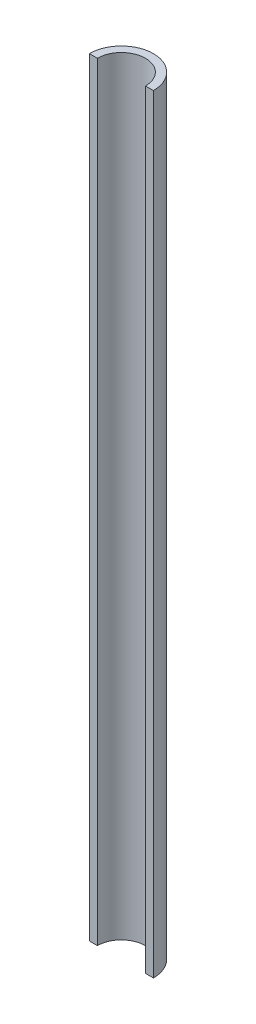
ISO-10303-21;
HEADER;
FILE_DESCRIPTION(('STEP AP214'),'2;1');
FILE_NAME('part.step','',(''),(''),'','','');
FILE_SCHEMA(('AUTOMOTIVE_DESIGN { 1 0 10303 214 1 1 1 1 }'));
ENDSEC;
DATA;
#1=APPLICATION_CONTEXT('core data for automotive mechanical design processes');
#2=APPLICATION_PROTOCOL_DEFINITION('international standard','automotive_design',2000,#1);
#3=PRODUCT_CONTEXT('',#1,'mechanical');
#4=PRODUCT('Part','Part','',(#3));
#5=PRODUCT_RELATED_PRODUCT_CATEGORY('part','',(#4));
#6=PRODUCT_DEFINITION_FORMATION('','',#4);
#7=PRODUCT_DEFINITION_CONTEXT('part definition',#1,'design');
#8=PRODUCT_DEFINITION('design','',#6,#7);
#9=PRODUCT_DEFINITION_SHAPE('','',#8);
#10=(LENGTH_UNIT() NAMED_UNIT(*) SI_UNIT(.MILLI.,.METRE.));
#11=(NAMED_UNIT(*) PLANE_ANGLE_UNIT() SI_UNIT($,.RADIAN.));
#12=(NAMED_UNIT(*) SI_UNIT($,.STERADIAN.) SOLID_ANGLE_UNIT());
#13=UNCERTAINTY_MEASURE_WITH_UNIT(LENGTH_MEASURE(1.E-05),#10,'distance_accuracy_value','');
#14=(GEOMETRIC_REPRESENTATION_CONTEXT(3) GLOBAL_UNCERTAINTY_ASSIGNED_CONTEXT((#13)) GLOBAL_UNIT_ASSIGNED_CONTEXT((#10,
#11,#12)) REPRESENTATION_CONTEXT('',''));
#15=CARTESIAN_POINT('',(0.,0.,0.));
#16=DIRECTION('',(0.,0.,1.));
#17=DIRECTION('',(1.,0.,0.));
#18=AXIS2_PLACEMENT_3D('',#15,#16,#17);
#19=CARTESIAN_POINT('',(0.,76.2,0.));
#20=DIRECTION('',(0.,-1.,0.));
#21=DIRECTION('',(0.,0.,-1.));
#22=AXIS2_PLACEMENT_3D('',#19,#20,#21);
#23=CYLINDRICAL_SURFACE('',#22,2.38125);
#24=CARTESIAN_POINT('',(0.,0.,0.));
#25=DIRECTION('',(0.,-1.,0.));
#26=DIRECTION('',(0.,0.,-1.));
#27=AXIS2_PLACEMENT_3D('',#24,#25,#26);
#28=CIRCLE('',#27,2.38125);
#29=CARTESIAN_POINT('',(-2.38125,0.,0.));
#30=VERTEX_POINT('',#29);
#31=CARTESIAN_POINT('',(2.38125,0.,0.));
#32=VERTEX_POINT('',#31);
#33=EDGE_CURVE('E97',#30,#32,#28,.T.);
#34=ORIENTED_EDGE('',*,*,#33,.T.);
#35=DIRECTION('',(0.,-1.,0.));
#36=VECTOR('',#35,1.);
#37=CARTESIAN_POINT('',(2.38125,76.2,0.));
#38=LINE('',#37,#36);
#39=CARTESIAN_POINT('',(2.38125,76.2,0.));
#40=VERTEX_POINT('',#39);
#41=EDGE_CURVE('E11',#40,#32,#38,.T.);
#42=ORIENTED_EDGE('',*,*,#41,.F.);
#43=CARTESIAN_POINT('',(0.,76.2,0.));
#44=DIRECTION('',(0.,-1.,0.));
#45=DIRECTION('',(0.,0.,-1.));
#46=AXIS2_PLACEMENT_3D('',#43,#44,#45);
#47=CIRCLE('',#46,2.38125);
#48=CARTESIAN_POINT('',(-2.38125,76.2,0.));
#49=VERTEX_POINT('',#48);
#50=EDGE_CURVE('E85',#49,#40,#47,.T.);
#51=ORIENTED_EDGE('',*,*,#50,.F.);
#52=DIRECTION('',(0.,-1.,0.));
#53=VECTOR('',#52,1.);
#54=CARTESIAN_POINT('',(-2.38125,76.2,0.));
#55=LINE('',#54,#53);
#56=EDGE_CURVE('E93',#49,#30,#55,.T.);
#57=ORIENTED_EDGE('',*,*,#56,.T.);
#58=EDGE_LOOP('',(#34,#42,#51,#57));
#59=FACE_BOUND('',#58,.T.);
#60=ADVANCED_FACE('F34',(#59),#23,.F.);
#61=CARTESIAN_POINT('',(2.38125,76.2,0.));
#62=DIRECTION('',(0.,0.,-1.));
#63=DIRECTION('',(-1.,0.,0.));
#64=AXIS2_PLACEMENT_3D('',#61,#62,#63);
#65=PLANE('',#64);
#66=DIRECTION('',(1.,0.,0.));
#67=VECTOR('',#66,1.);
#68=CARTESIAN_POINT('',(2.38125,0.,0.));
#69=LINE('',#68,#67);
#70=CARTESIAN_POINT('',(3.175,0.,0.));
#71=VERTEX_POINT('',#70);
#72=EDGE_CURVE('E89',#32,#71,#69,.T.);
#73=ORIENTED_EDGE('',*,*,#72,.T.);
#74=DIRECTION('',(0.,-1.,0.));
#75=VECTOR('',#74,1.);
#76=CARTESIAN_POINT('',(3.175,76.2,0.));
#77=LINE('',#76,#75);
#78=CARTESIAN_POINT('',(3.175,76.2,0.));
#79=VERTEX_POINT('',#78);
#80=EDGE_CURVE('E42',#79,#71,#77,.T.);
#81=ORIENTED_EDGE('',*,*,#80,.F.);
#82=DIRECTION('',(1.,0.,0.));
#83=VECTOR('',#82,1.);
#84=CARTESIAN_POINT('',(2.38125,76.2,0.));
#85=LINE('',#84,#83);
#86=EDGE_CURVE('E80',#40,#79,#85,.T.);
#87=ORIENTED_EDGE('',*,*,#86,.F.);
#88=ORIENTED_EDGE('',*,*,#41,.T.);
#89=EDGE_LOOP('',(#73,#81,#87,#88));
#90=FACE_BOUND('',#89,.T.);
#91=ADVANCED_FACE('F88',(#90),#65,.F.);
#92=CARTESIAN_POINT('',(0.,76.2,0.));
#93=DIRECTION('',(0.,-1.,0.));
#94=DIRECTION('',(0.,0.,-1.));
#95=AXIS2_PLACEMENT_3D('',#92,#93,#94);
#96=CYLINDRICAL_SURFACE('',#95,3.175);
#97=CARTESIAN_POINT('',(0.,0.,0.));
#98=DIRECTION('',(0.,1.,0.));
#99=DIRECTION('',(0.,0.,-1.));
#100=AXIS2_PLACEMENT_3D('',#97,#98,#99);
#101=CIRCLE('',#100,3.175);
#102=CARTESIAN_POINT('',(-3.175,0.,0.));
#103=VERTEX_POINT('',#102);
#104=EDGE_CURVE('E67',#71,#103,#101,.T.);
#105=ORIENTED_EDGE('',*,*,#104,.T.);
#106=DIRECTION('',(0.,-1.,0.));
#107=VECTOR('',#106,1.);
#108=CARTESIAN_POINT('',(-3.175,76.2,0.));
#109=LINE('',#108,#107);
#110=CARTESIAN_POINT('',(-3.175,76.2,0.));
#111=VERTEX_POINT('',#110);
#112=EDGE_CURVE('E90',#111,#103,#109,.T.);
#113=ORIENTED_EDGE('',*,*,#112,.F.);
#114=CARTESIAN_POINT('',(0.,76.2,0.));
#115=DIRECTION('',(0.,1.,0.));
#116=DIRECTION('',(0.,0.,-1.));
#117=AXIS2_PLACEMENT_3D('',#114,#115,#116);
#118=CIRCLE('',#117,3.175);
#119=EDGE_CURVE('E83',#79,#111,#118,.T.);
#120=ORIENTED_EDGE('',*,*,#119,.F.);
#121=ORIENTED_EDGE('',*,*,#80,.T.);
#122=EDGE_LOOP('',(#105,#113,#120,#121));
#123=FACE_BOUND('',#122,.T.);
#124=ADVANCED_FACE('F91',(#123),#96,.T.);
#125=CARTESIAN_POINT('',(-3.175,76.2,0.));
#126=DIRECTION('',(0.,0.,-1.));
#127=DIRECTION('',(-1.,0.,0.));
#128=AXIS2_PLACEMENT_3D('',#125,#126,#127);
#129=PLANE('',#128);
#130=DIRECTION('',(1.,0.,0.));
#131=VECTOR('',#130,1.);
#132=CARTESIAN_POINT('',(-3.175,0.,0.));
#133=LINE('',#132,#131);
#134=EDGE_CURVE('E73',#103,#30,#133,.T.);
#135=ORIENTED_EDGE('',*,*,#134,.T.);
#136=ORIENTED_EDGE('',*,*,#56,.F.);
#137=DIRECTION('',(1.,0.,0.));
#138=VECTOR('',#137,1.);
#139=CARTESIAN_POINT('',(-3.175,76.2,0.));
#140=LINE('',#139,#138);
#141=EDGE_CURVE('E50',#111,#49,#140,.T.);
#142=ORIENTED_EDGE('',*,*,#141,.F.);
#143=ORIENTED_EDGE('',*,*,#112,.T.);
#144=EDGE_LOOP('',(#135,#136,#142,#143));
#145=FACE_BOUND('',#144,.T.);
#146=ADVANCED_FACE('F104',(#145),#129,.F.);
#147=CARTESIAN_POINT('',(0.,76.2,0.));
#148=DIRECTION('',(0.,-1.,0.));
#149=DIRECTION('',(0.,0.,-1.));
#150=AXIS2_PLACEMENT_3D('',#147,#148,#149);
#151=PLANE('',#150);
#152=ORIENTED_EDGE('',*,*,#50,.T.);
#153=ORIENTED_EDGE('',*,*,#86,.T.);
#154=ORIENTED_EDGE('',*,*,#119,.T.);
#155=ORIENTED_EDGE('',*,*,#141,.T.);
#156=EDGE_LOOP('',(#152,#153,#154,#155));
#157=FACE_BOUND('',#156,.T.);
#158=ADVANCED_FACE('F81',(#157),#151,.F.);
#159=CARTESIAN_POINT('',(0.,0.,0.));
#160=DIRECTION('',(0.,-1.,0.));
#161=DIRECTION('',(0.,0.,-1.));
#162=AXIS2_PLACEMENT_3D('',#159,#160,#161);
#163=PLANE('',#162);
#164=ORIENTED_EDGE('',*,*,#33,.F.);
#165=ORIENTED_EDGE('',*,*,#134,.F.);
#166=ORIENTED_EDGE('',*,*,#104,.F.);
#167=ORIENTED_EDGE('',*,*,#72,.F.);
#168=EDGE_LOOP('',(#164,#165,#166,#167));
#169=FACE_BOUND('',#168,.T.);
#170=ADVANCED_FACE('F107',(#169),#163,.T.);
#171=CLOSED_SHELL('',(#60,#91,#124,#146,#158,#170));
#172=MANIFOLD_SOLID_BREP('B2',#171);
#173=ADVANCED_BREP_SHAPE_REPRESENTATION('',(#18,#172),#14);
#174=SHAPE_DEFINITION_REPRESENTATION(#9,#173);
ENDSEC;
END-ISO-10303-21;
